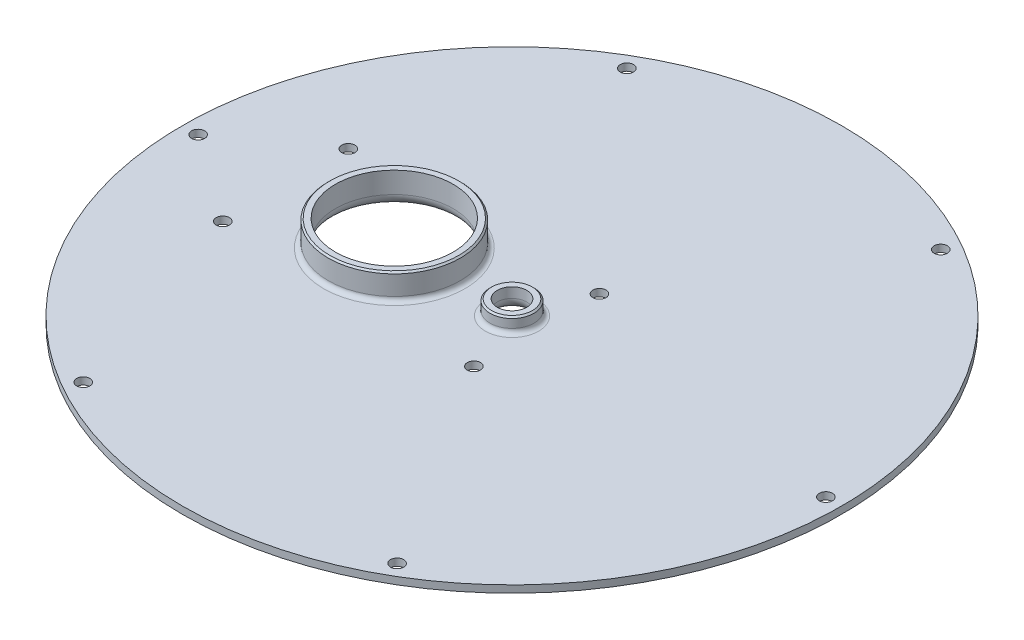
ISO-10303-21;
HEADER;
FILE_DESCRIPTION(('STEP AP214'),'2;1');
FILE_NAME('part.step','',(''),(''),'','','');
FILE_SCHEMA(('AUTOMOTIVE_DESIGN { 1 0 10303 214 1 1 1 1 }'));
ENDSEC;
DATA;
#1=APPLICATION_CONTEXT('core data for automotive mechanical design processes');
#2=APPLICATION_PROTOCOL_DEFINITION('international standard','automotive_design',2000,#1);
#3=PRODUCT_CONTEXT('',#1,'mechanical');
#4=PRODUCT('Part','Part','',(#3));
#5=PRODUCT_RELATED_PRODUCT_CATEGORY('part','',(#4));
#6=PRODUCT_DEFINITION_FORMATION('','',#4);
#7=PRODUCT_DEFINITION_CONTEXT('part definition',#1,'design');
#8=PRODUCT_DEFINITION('design','',#6,#7);
#9=PRODUCT_DEFINITION_SHAPE('','',#8);
#10=(LENGTH_UNIT() NAMED_UNIT(*) SI_UNIT(.MILLI.,.METRE.));
#11=(NAMED_UNIT(*) PLANE_ANGLE_UNIT() SI_UNIT($,.RADIAN.));
#12=(NAMED_UNIT(*) SI_UNIT($,.STERADIAN.) SOLID_ANGLE_UNIT());
#13=UNCERTAINTY_MEASURE_WITH_UNIT(LENGTH_MEASURE(1.E-05),#10,'distance_accuracy_value','');
#14=(GEOMETRIC_REPRESENTATION_CONTEXT(3) GLOBAL_UNCERTAINTY_ASSIGNED_CONTEXT((#13)) GLOBAL_UNIT_ASSIGNED_CONTEXT((#10,
#11,#12)) REPRESENTATION_CONTEXT('',''));
#15=CARTESIAN_POINT('',(0.,0.,0.));
#16=DIRECTION('',(0.,0.,1.));
#17=DIRECTION('',(1.,0.,0.));
#18=AXIS2_PLACEMENT_3D('',#15,#16,#17);
#19=CARTESIAN_POINT('',(0.,-1.15,0.));
#20=DIRECTION('',(0.,1.,0.));
#21=DIRECTION('',(0.,0.,1.));
#22=AXIS2_PLACEMENT_3D('',#19,#20,#21);
#23=CYLINDRICAL_SURFACE('',#22,52.5);
#24=CARTESIAN_POINT('',(0.,-1.15,0.));
#25=DIRECTION('',(0.,1.,0.));
#26=DIRECTION('',(0.,0.,1.));
#27=AXIS2_PLACEMENT_3D('',#24,#25,#26);
#28=CIRCLE('',#27,52.5);
#29=CARTESIAN_POINT('',(0.,-1.15,52.5));
#30=VERTEX_POINT('',#29);
#31=EDGE_CURVE('E358',#30,#30,#28,.T.);
#32=ORIENTED_EDGE('',*,*,#31,.T.);
#33=EDGE_LOOP('',(#32));
#34=FACE_BOUND('',#33,.T.);
#35=CARTESIAN_POINT('',(0.,0.,0.));
#36=DIRECTION('',(0.,1.,0.));
#37=DIRECTION('',(0.,0.,1.));
#38=AXIS2_PLACEMENT_3D('',#35,#36,#37);
#39=CIRCLE('',#38,52.5);
#40=CARTESIAN_POINT('',(0.,0.,52.5));
#41=VERTEX_POINT('',#40);
#42=EDGE_CURVE('E357',#41,#41,#39,.T.);
#43=ORIENTED_EDGE('',*,*,#42,.F.);
#44=EDGE_LOOP('',(#43));
#45=FACE_BOUND('',#44,.T.);
#46=ADVANCED_FACE('F149',(#34,#45),#23,.T.);
#47=CARTESIAN_POINT('',(0.,-1.15,0.));
#48=DIRECTION('',(0.,1.,0.));
#49=DIRECTION('',(0.,0.,1.));
#50=AXIS2_PLACEMENT_3D('',#47,#48,#49);
#51=PLANE('',#50);
#52=CARTESIAN_POINT('',(0.,-1.15,0.));
#53=DIRECTION('',(0.,1.,0.));
#54=DIRECTION('',(0.,0.,1.));
#55=AXIS2_PLACEMENT_3D('',#52,#53,#54);
#56=CIRCLE('',#55,4.2366);
#57=CARTESIAN_POINT('',(0.,-1.15,4.2366));
#58=VERTEX_POINT('',#57);
#59=EDGE_CURVE('E216',#58,#58,#56,.T.);
#60=ORIENTED_EDGE('',*,*,#59,.T.);
#61=EDGE_LOOP('',(#60));
#62=FACE_BOUND('',#61,.T.);
#63=CARTESIAN_POINT('',(-18.75,-1.15,0.));
#64=DIRECTION('',(0.,1.,0.));
#65=DIRECTION('',(0.,0.,1.));
#66=AXIS2_PLACEMENT_3D('',#63,#64,#65);
#67=CIRCLE('',#66,11.2616);
#68=CARTESIAN_POINT('',(-18.75,-1.15,11.2616));
#69=VERTEX_POINT('',#68);
#70=EDGE_CURVE('E249',#69,#69,#67,.T.);
#71=ORIENTED_EDGE('',*,*,#70,.T.);
#72=EDGE_LOOP('',(#71));
#73=FACE_BOUND('',#72,.T.);
#74=CARTESIAN_POINT('',(-50.,-1.15,0.));
#75=DIRECTION('',(0.,1.,0.));
#76=DIRECTION('',(0.,0.,1.));
#77=AXIS2_PLACEMENT_3D('',#74,#75,#76);
#78=CIRCLE('',#77,1.05);
#79=CARTESIAN_POINT('',(-50.,-1.15,1.05));
#80=VERTEX_POINT('',#79);
#81=EDGE_CURVE('E281',#80,#80,#78,.T.);
#82=ORIENTED_EDGE('',*,*,#81,.T.);
#83=EDGE_LOOP('',(#82));
#84=FACE_BOUND('',#83,.T.);
#85=CARTESIAN_POINT('',(-25.0000000000005,-1.15,43.3012701892216));
#86=DIRECTION('',(0.,1.,0.));
#87=DIRECTION('',(0.,0.,1.));
#88=AXIS2_PLACEMENT_3D('',#85,#86,#87);
#89=CIRCLE('',#88,1.05);
#90=CARTESIAN_POINT('',(-25.0000000000005,-1.15,44.3512701892216));
#91=VERTEX_POINT('',#90);
#92=EDGE_CURVE('E289',#91,#91,#89,.T.);
#93=ORIENTED_EDGE('',*,*,#92,.T.);
#94=EDGE_LOOP('',(#93));
#95=FACE_BOUND('',#94,.T.);
#96=CARTESIAN_POINT('',(24.9999999999996,-1.15,43.3012701892222));
#97=DIRECTION('',(0.,1.,0.));
#98=DIRECTION('',(0.,0.,1.));
#99=AXIS2_PLACEMENT_3D('',#96,#97,#98);
#100=CIRCLE('',#99,1.05);
#101=CARTESIAN_POINT('',(24.9999999999996,-1.15,44.3512701892222));
#102=VERTEX_POINT('',#101);
#103=EDGE_CURVE('E297',#102,#102,#100,.T.);
#104=ORIENTED_EDGE('',*,*,#103,.T.);
#105=EDGE_LOOP('',(#104));
#106=FACE_BOUND('',#105,.T.);
#107=CARTESIAN_POINT('',(50.,-1.15,3.49148133884313E-13));
#108=DIRECTION('',(0.,1.,0.));
#109=DIRECTION('',(0.,0.,1.));
#110=AXIS2_PLACEMENT_3D('',#107,#108,#109);
#111=CIRCLE('',#110,1.05);
#112=CARTESIAN_POINT('',(50.,-1.15,1.05000000000035));
#113=VERTEX_POINT('',#112);
#114=EDGE_CURVE('E305',#113,#113,#111,.T.);
#115=ORIENTED_EDGE('',*,*,#114,.T.);
#116=EDGE_LOOP('',(#115));
#117=FACE_BOUND('',#116,.T.);
#118=CARTESIAN_POINT('',(25.0000000000002,-1.15,-43.3012701892218));
#119=DIRECTION('',(0.,1.,0.));
#120=DIRECTION('',(0.,0.,1.));
#121=AXIS2_PLACEMENT_3D('',#118,#119,#120);
#122=CIRCLE('',#121,1.05);
#123=CARTESIAN_POINT('',(25.0000000000002,-1.15,-42.2512701892218));
#124=VERTEX_POINT('',#123);
#125=EDGE_CURVE('E313',#124,#124,#122,.T.);
#126=ORIENTED_EDGE('',*,*,#125,.T.);
#127=EDGE_LOOP('',(#126));
#128=FACE_BOUND('',#127,.T.);
#129=CARTESIAN_POINT('',(-24.9999999999999,-1.15,-43.301270189222));
#130=DIRECTION('',(0.,1.,0.));
#131=DIRECTION('',(0.,0.,1.));
#132=AXIS2_PLACEMENT_3D('',#129,#130,#131);
#133=CIRCLE('',#132,1.05);
#134=CARTESIAN_POINT('',(-24.9999999999999,-1.15,-42.251270189222));
#135=VERTEX_POINT('',#134);
#136=EDGE_CURVE('E321',#135,#135,#133,.T.);
#137=ORIENTED_EDGE('',*,*,#136,.T.);
#138=EDGE_LOOP('',(#137));
#139=FACE_BOUND('',#138,.T.);
#140=CARTESIAN_POINT('',(3.92949192431122,-1.15,-10.));
#141=DIRECTION('',(0.,1.,0.));
#142=DIRECTION('',(0.,0.,1.));
#143=AXIS2_PLACEMENT_3D('',#140,#141,#142);
#144=CIRCLE('',#143,1.05);
#145=CARTESIAN_POINT('',(3.92949192431122,-1.15,-8.95));
#146=VERTEX_POINT('',#145);
#147=EDGE_CURVE('E329',#146,#146,#144,.T.);
#148=ORIENTED_EDGE('',*,*,#147,.T.);
#149=EDGE_LOOP('',(#148));
#150=FACE_BOUND('',#149,.T.);
#151=CARTESIAN_POINT('',(3.92949192431122,-1.15,10.));
#152=DIRECTION('',(0.,1.,0.));
#153=DIRECTION('',(0.,0.,1.));
#154=AXIS2_PLACEMENT_3D('',#151,#152,#153);
#155=CIRCLE('',#154,1.05);
#156=CARTESIAN_POINT('',(3.92949192431122,-1.15,11.05));
#157=VERTEX_POINT('',#156);
#158=EDGE_CURVE('E337',#157,#157,#155,.T.);
#159=ORIENTED_EDGE('',*,*,#158,.T.);
#160=EDGE_LOOP('',(#159));
#161=FACE_BOUND('',#160,.T.);
#162=CARTESIAN_POINT('',(-36.0705080756888,-1.15,10.));
#163=DIRECTION('',(0.,1.,0.));
#164=DIRECTION('',(0.,0.,1.));
#165=AXIS2_PLACEMENT_3D('',#162,#163,#164);
#166=CIRCLE('',#165,1.05);
#167=CARTESIAN_POINT('',(-36.0705080756888,-1.15,11.05));
#168=VERTEX_POINT('',#167);
#169=EDGE_CURVE('E345',#168,#168,#166,.T.);
#170=ORIENTED_EDGE('',*,*,#169,.T.);
#171=EDGE_LOOP('',(#170));
#172=FACE_BOUND('',#171,.T.);
#173=CARTESIAN_POINT('',(-36.0705080756888,-1.15,-10.));
#174=DIRECTION('',(0.,1.,0.));
#175=DIRECTION('',(0.,0.,1.));
#176=AXIS2_PLACEMENT_3D('',#173,#174,#175);
#177=CIRCLE('',#176,1.05);
#178=CARTESIAN_POINT('',(-36.0705080756888,-1.15,-8.95));
#179=VERTEX_POINT('',#178);
#180=EDGE_CURVE('E353',#179,#179,#177,.T.);
#181=ORIENTED_EDGE('',*,*,#180,.T.);
#182=EDGE_LOOP('',(#181));
#183=FACE_BOUND('',#182,.T.);
#184=ORIENTED_EDGE('',*,*,#31,.F.);
#185=EDGE_LOOP('',(#184));
#186=FACE_BOUND('',#185,.T.);
#187=ADVANCED_FACE('F401',(#62,#73,#84,#95,#106,#117,#128,#139,#150,#161,#172,#183,#186),#51,.F.);
#188=CARTESIAN_POINT('',(0.,0.,0.));
#189=DIRECTION('',(0.,1.,0.));
#190=DIRECTION('',(0.,0.,1.));
#191=AXIS2_PLACEMENT_3D('',#188,#189,#190);
#192=PLANE('',#191);
#193=CARTESIAN_POINT('',(0.,0.,0.));
#194=DIRECTION('',(0.,1.,0.));
#195=DIRECTION('',(0.,0.,1.));
#196=AXIS2_PLACEMENT_3D('',#193,#194,#195);
#197=CIRCLE('',#196,4.2366);
#198=CARTESIAN_POINT('',(0.,0.,4.2366));
#199=VERTEX_POINT('',#198);
#200=EDGE_CURVE('E369',#199,#199,#197,.T.);
#201=ORIENTED_EDGE('',*,*,#200,.F.);
#202=EDGE_LOOP('',(#201));
#203=FACE_BOUND('',#202,.T.);
#204=CARTESIAN_POINT('',(-18.75,0.,0.));
#205=DIRECTION('',(0.,1.,0.));
#206=DIRECTION('',(0.,0.,1.));
#207=AXIS2_PLACEMENT_3D('',#204,#205,#206);
#208=CIRCLE('',#207,11.2616);
#209=CARTESIAN_POINT('',(-18.75,0.,11.2616));
#210=VERTEX_POINT('',#209);
#211=EDGE_CURVE('E362',#210,#210,#208,.T.);
#212=ORIENTED_EDGE('',*,*,#211,.F.);
#213=EDGE_LOOP('',(#212));
#214=FACE_BOUND('',#213,.T.);
#215=CARTESIAN_POINT('',(-50.,0.,0.));
#216=DIRECTION('',(0.,1.,0.));
#217=DIRECTION('',(0.,0.,1.));
#218=AXIS2_PLACEMENT_3D('',#215,#216,#217);
#219=CIRCLE('',#218,1.04999999999999);
#220=CARTESIAN_POINT('',(-50.,0.,1.04999999999999));
#221=VERTEX_POINT('',#220);
#222=EDGE_CURVE('E277',#221,#221,#219,.T.);
#223=ORIENTED_EDGE('',*,*,#222,.F.);
#224=EDGE_LOOP('',(#223));
#225=FACE_BOUND('',#224,.T.);
#226=CARTESIAN_POINT('',(-25.0000000000005,0.,43.3012701892216));
#227=DIRECTION('',(0.,1.,0.));
#228=DIRECTION('',(0.,0.,1.));
#229=AXIS2_PLACEMENT_3D('',#226,#227,#228);
#230=CIRCLE('',#229,1.04999999999999);
#231=CARTESIAN_POINT('',(-25.0000000000005,0.,44.3512701892216));
#232=VERTEX_POINT('',#231);
#233=EDGE_CURVE('E285',#232,#232,#230,.T.);
#234=ORIENTED_EDGE('',*,*,#233,.F.);
#235=EDGE_LOOP('',(#234));
#236=FACE_BOUND('',#235,.T.);
#237=CARTESIAN_POINT('',(24.9999999999996,0.,43.3012701892222));
#238=DIRECTION('',(0.,1.,0.));
#239=DIRECTION('',(0.,0.,1.));
#240=AXIS2_PLACEMENT_3D('',#237,#238,#239);
#241=CIRCLE('',#240,1.04999999999999);
#242=CARTESIAN_POINT('',(24.9999999999996,0.,44.3512701892222));
#243=VERTEX_POINT('',#242);
#244=EDGE_CURVE('E293',#243,#243,#241,.T.);
#245=ORIENTED_EDGE('',*,*,#244,.F.);
#246=EDGE_LOOP('',(#245));
#247=FACE_BOUND('',#246,.T.);
#248=CARTESIAN_POINT('',(50.,0.,3.49148133884313E-13));
#249=DIRECTION('',(0.,1.,0.));
#250=DIRECTION('',(0.,0.,1.));
#251=AXIS2_PLACEMENT_3D('',#248,#249,#250);
#252=CIRCLE('',#251,1.04999999999999);
#253=CARTESIAN_POINT('',(50.,0.,1.05000000000034));
#254=VERTEX_POINT('',#253);
#255=EDGE_CURVE('E301',#254,#254,#252,.T.);
#256=ORIENTED_EDGE('',*,*,#255,.F.);
#257=EDGE_LOOP('',(#256));
#258=FACE_BOUND('',#257,.T.);
#259=CARTESIAN_POINT('',(25.0000000000002,0.,-43.3012701892218));
#260=DIRECTION('',(0.,1.,0.));
#261=DIRECTION('',(0.,0.,1.));
#262=AXIS2_PLACEMENT_3D('',#259,#260,#261);
#263=CIRCLE('',#262,1.04999999999999);
#264=CARTESIAN_POINT('',(25.0000000000002,0.,-42.2512701892218));
#265=VERTEX_POINT('',#264);
#266=EDGE_CURVE('E309',#265,#265,#263,.T.);
#267=ORIENTED_EDGE('',*,*,#266,.F.);
#268=EDGE_LOOP('',(#267));
#269=FACE_BOUND('',#268,.T.);
#270=CARTESIAN_POINT('',(-24.9999999999999,0.,-43.301270189222));
#271=DIRECTION('',(0.,1.,0.));
#272=DIRECTION('',(0.,0.,1.));
#273=AXIS2_PLACEMENT_3D('',#270,#271,#272);
#274=CIRCLE('',#273,1.04999999999999);
#275=CARTESIAN_POINT('',(-24.9999999999999,0.,-42.251270189222));
#276=VERTEX_POINT('',#275);
#277=EDGE_CURVE('E317',#276,#276,#274,.T.);
#278=ORIENTED_EDGE('',*,*,#277,.F.);
#279=EDGE_LOOP('',(#278));
#280=FACE_BOUND('',#279,.T.);
#281=CARTESIAN_POINT('',(3.92949192431122,0.,-10.));
#282=DIRECTION('',(0.,1.,0.));
#283=DIRECTION('',(0.,0.,1.));
#284=AXIS2_PLACEMENT_3D('',#281,#282,#283);
#285=CIRCLE('',#284,1.04999999999999);
#286=CARTESIAN_POINT('',(3.92949192431122,0.,-8.95000000000001));
#287=VERTEX_POINT('',#286);
#288=EDGE_CURVE('E325',#287,#287,#285,.T.);
#289=ORIENTED_EDGE('',*,*,#288,.F.);
#290=EDGE_LOOP('',(#289));
#291=FACE_BOUND('',#290,.T.);
#292=CARTESIAN_POINT('',(3.92949192431122,0.,10.));
#293=DIRECTION('',(0.,1.,0.));
#294=DIRECTION('',(0.,0.,1.));
#295=AXIS2_PLACEMENT_3D('',#292,#293,#294);
#296=CIRCLE('',#295,1.04999999999999);
#297=CARTESIAN_POINT('',(3.92949192431122,0.,11.05));
#298=VERTEX_POINT('',#297);
#299=EDGE_CURVE('E333',#298,#298,#296,.T.);
#300=ORIENTED_EDGE('',*,*,#299,.F.);
#301=EDGE_LOOP('',(#300));
#302=FACE_BOUND('',#301,.T.);
#303=CARTESIAN_POINT('',(-36.0705080756888,0.,10.));
#304=DIRECTION('',(0.,1.,0.));
#305=DIRECTION('',(0.,0.,1.));
#306=AXIS2_PLACEMENT_3D('',#303,#304,#305);
#307=CIRCLE('',#306,1.04999999999999);
#308=CARTESIAN_POINT('',(-36.0705080756888,0.,11.05));
#309=VERTEX_POINT('',#308);
#310=EDGE_CURVE('E341',#309,#309,#307,.T.);
#311=ORIENTED_EDGE('',*,*,#310,.F.);
#312=EDGE_LOOP('',(#311));
#313=FACE_BOUND('',#312,.T.);
#314=CARTESIAN_POINT('',(-36.0705080756888,0.,-10.));
#315=DIRECTION('',(0.,1.,0.));
#316=DIRECTION('',(0.,0.,1.));
#317=AXIS2_PLACEMENT_3D('',#314,#315,#316);
#318=CIRCLE('',#317,1.04999999999999);
#319=CARTESIAN_POINT('',(-36.0705080756888,0.,-8.95000000000001));
#320=VERTEX_POINT('',#319);
#321=EDGE_CURVE('E349',#320,#320,#318,.T.);
#322=ORIENTED_EDGE('',*,*,#321,.F.);
#323=EDGE_LOOP('',(#322));
#324=FACE_BOUND('',#323,.T.);
#325=ORIENTED_EDGE('',*,*,#42,.T.);
#326=EDGE_LOOP('',(#325));
#327=FACE_BOUND('',#326,.T.);
#328=ADVANCED_FACE('F397',(#203,#214,#225,#236,#247,#258,#269,#280,#291,#302,#313,#324,#327),
#192,.T.);
#329=CARTESIAN_POINT('',(-36.0705080756888,0.,-10.));
#330=DIRECTION('',(0.,1.,0.));
#331=DIRECTION('',(0.,0.,1.));
#332=AXIS2_PLACEMENT_3D('',#329,#330,#331);
#333=CYLINDRICAL_SURFACE('',#332,1.05);
#334=ORIENTED_EDGE('',*,*,#180,.F.);
#335=EDGE_LOOP('',(#334));
#336=FACE_BOUND('',#335,.T.);
#337=ORIENTED_EDGE('',*,*,#321,.T.);
#338=EDGE_LOOP('',(#337));
#339=FACE_BOUND('',#338,.T.);
#340=ADVANCED_FACE('F400',(#336,#339),#333,.F.);
#341=CARTESIAN_POINT('',(-36.0705080756888,0.,10.));
#342=DIRECTION('',(0.,1.,0.));
#343=DIRECTION('',(0.,0.,1.));
#344=AXIS2_PLACEMENT_3D('',#341,#342,#343);
#345=CYLINDRICAL_SURFACE('',#344,1.05);
#346=ORIENTED_EDGE('',*,*,#169,.F.);
#347=EDGE_LOOP('',(#346));
#348=FACE_BOUND('',#347,.T.);
#349=ORIENTED_EDGE('',*,*,#310,.T.);
#350=EDGE_LOOP('',(#349));
#351=FACE_BOUND('',#350,.T.);
#352=ADVANCED_FACE('F507',(#348,#351),#345,.F.);
#353=CARTESIAN_POINT('',(3.92949192431122,0.,10.));
#354=DIRECTION('',(0.,1.,0.));
#355=DIRECTION('',(0.,0.,1.));
#356=AXIS2_PLACEMENT_3D('',#353,#354,#355);
#357=CYLINDRICAL_SURFACE('',#356,1.04999999999999);
#358=ORIENTED_EDGE('',*,*,#158,.F.);
#359=EDGE_LOOP('',(#358));
#360=FACE_BOUND('',#359,.T.);
#361=ORIENTED_EDGE('',*,*,#299,.T.);
#362=EDGE_LOOP('',(#361));
#363=FACE_BOUND('',#362,.T.);
#364=ADVANCED_FACE('F503',(#360,#363),#357,.F.);
#365=CARTESIAN_POINT('',(3.92949192431122,0.,-10.));
#366=DIRECTION('',(0.,1.,0.));
#367=DIRECTION('',(0.,0.,1.));
#368=AXIS2_PLACEMENT_3D('',#365,#366,#367);
#369=CYLINDRICAL_SURFACE('',#368,1.04999999999999);
#370=ORIENTED_EDGE('',*,*,#147,.F.);
#371=EDGE_LOOP('',(#370));
#372=FACE_BOUND('',#371,.T.);
#373=ORIENTED_EDGE('',*,*,#288,.T.);
#374=EDGE_LOOP('',(#373));
#375=FACE_BOUND('',#374,.T.);
#376=ADVANCED_FACE('F499',(#372,#375),#369,.F.);
#377=CARTESIAN_POINT('',(-24.9999999999999,0.,-43.301270189222));
#378=DIRECTION('',(0.,1.,0.));
#379=DIRECTION('',(0.,0.,1.));
#380=AXIS2_PLACEMENT_3D('',#377,#378,#379);
#381=CYLINDRICAL_SURFACE('',#380,1.04999999999999);
#382=ORIENTED_EDGE('',*,*,#136,.F.);
#383=EDGE_LOOP('',(#382));
#384=FACE_BOUND('',#383,.T.);
#385=ORIENTED_EDGE('',*,*,#277,.T.);
#386=EDGE_LOOP('',(#385));
#387=FACE_BOUND('',#386,.T.);
#388=ADVANCED_FACE('F495',(#384,#387),#381,.F.);
#389=CARTESIAN_POINT('',(25.0000000000002,0.,-43.3012701892218));
#390=DIRECTION('',(0.,1.,0.));
#391=DIRECTION('',(0.,0.,1.));
#392=AXIS2_PLACEMENT_3D('',#389,#390,#391);
#393=CYLINDRICAL_SURFACE('',#392,1.04999999999999);
#394=ORIENTED_EDGE('',*,*,#125,.F.);
#395=EDGE_LOOP('',(#394));
#396=FACE_BOUND('',#395,.T.);
#397=ORIENTED_EDGE('',*,*,#266,.T.);
#398=EDGE_LOOP('',(#397));
#399=FACE_BOUND('',#398,.T.);
#400=ADVANCED_FACE('F491',(#396,#399),#393,.F.);
#401=CARTESIAN_POINT('',(50.,0.,3.49148133884313E-13));
#402=DIRECTION('',(0.,1.,0.));
#403=DIRECTION('',(0.,0.,1.));
#404=AXIS2_PLACEMENT_3D('',#401,#402,#403);
#405=CYLINDRICAL_SURFACE('',#404,1.05);
#406=ORIENTED_EDGE('',*,*,#114,.F.);
#407=EDGE_LOOP('',(#406));
#408=FACE_BOUND('',#407,.T.);
#409=ORIENTED_EDGE('',*,*,#255,.T.);
#410=EDGE_LOOP('',(#409));
#411=FACE_BOUND('',#410,.T.);
#412=ADVANCED_FACE('F487',(#408,#411),#405,.F.);
#413=CARTESIAN_POINT('',(24.9999999999996,0.,43.3012701892222));
#414=DIRECTION('',(0.,1.,0.));
#415=DIRECTION('',(0.,0.,1.));
#416=AXIS2_PLACEMENT_3D('',#413,#414,#415);
#417=CYLINDRICAL_SURFACE('',#416,1.04999999999999);
#418=ORIENTED_EDGE('',*,*,#103,.F.);
#419=EDGE_LOOP('',(#418));
#420=FACE_BOUND('',#419,.T.);
#421=ORIENTED_EDGE('',*,*,#244,.T.);
#422=EDGE_LOOP('',(#421));
#423=FACE_BOUND('',#422,.T.);
#424=ADVANCED_FACE('F483',(#420,#423),#417,.F.);
#425=CARTESIAN_POINT('',(-25.0000000000005,0.,43.3012701892216));
#426=DIRECTION('',(0.,1.,0.));
#427=DIRECTION('',(0.,0.,1.));
#428=AXIS2_PLACEMENT_3D('',#425,#426,#427);
#429=CYLINDRICAL_SURFACE('',#428,1.04999999999999);
#430=ORIENTED_EDGE('',*,*,#92,.F.);
#431=EDGE_LOOP('',(#430));
#432=FACE_BOUND('',#431,.T.);
#433=ORIENTED_EDGE('',*,*,#233,.T.);
#434=EDGE_LOOP('',(#433));
#435=FACE_BOUND('',#434,.T.);
#436=ADVANCED_FACE('F479',(#432,#435),#429,.F.);
#437=CARTESIAN_POINT('',(-50.,0.,0.));
#438=DIRECTION('',(0.,1.,0.));
#439=DIRECTION('',(0.,0.,1.));
#440=AXIS2_PLACEMENT_3D('',#437,#438,#439);
#441=CYLINDRICAL_SURFACE('',#440,1.05);
#442=ORIENTED_EDGE('',*,*,#81,.F.);
#443=EDGE_LOOP('',(#442));
#444=FACE_BOUND('',#443,.T.);
#445=ORIENTED_EDGE('',*,*,#222,.T.);
#446=EDGE_LOOP('',(#445));
#447=FACE_BOUND('',#446,.T.);
#448=ADVANCED_FACE('F475',(#444,#447),#441,.F.);
#449=CARTESIAN_POINT('',(-18.75,4.1,0.));
#450=DIRECTION('',(0.,-1.,0.));
#451=DIRECTION('',(0.,0.,-1.));
#452=AXIS2_PLACEMENT_3D('',#449,#450,#451);
#453=PLANE('',#452);
#454=CARTESIAN_POINT('',(-18.75,4.1,0.));
#455=DIRECTION('',(0.,1.,0.));
#456=DIRECTION('',(0.,0.,1.));
#457=AXIS2_PLACEMENT_3D('',#454,#455,#456);
#458=CIRCLE('',#457,9.37500000000001);
#459=CARTESIAN_POINT('',(-18.75,4.1,9.37500000000001));
#460=VERTEX_POINT('',#459);
#461=EDGE_CURVE('E254',#460,#460,#458,.T.);
#462=ORIENTED_EDGE('',*,*,#461,.F.);
#463=EDGE_LOOP('',(#462));
#464=FACE_BOUND('',#463,.T.);
#465=CARTESIAN_POINT('',(-18.75,4.1,0.));
#466=DIRECTION('',(0.,-1.,0.));
#467=DIRECTION('',(0.,0.,-1.));
#468=AXIS2_PLACEMENT_3D('',#465,#466,#467);
#469=CIRCLE('',#468,10.275);
#470=CARTESIAN_POINT('',(-18.75,4.1,10.275));
#471=VERTEX_POINT('',#470);
#472=EDGE_CURVE('E160',#471,#471,#469,.F.);
#473=ORIENTED_EDGE('',*,*,#472,.T.);
#474=EDGE_LOOP('',(#473));
#475=FACE_BOUND('',#474,.T.);
#476=ADVANCED_FACE('F461',(#464,#475),#453,.F.);
#477=CARTESIAN_POINT('',(-18.75,0.,0.));
#478=DIRECTION('',(0.,1.,0.));
#479=DIRECTION('',(0.,0.,1.));
#480=AXIS2_PLACEMENT_3D('',#477,#478,#479);
#481=CYLINDRICAL_SURFACE('',#480,9.37500000000001);
#482=DIRECTION('',(0.,1.,0.));
#483=VECTOR('',#482,1.);
#484=CARTESIAN_POINT('',(-18.75,0.,9.37500000000001));
#485=LINE('',#484,#483);
#486=CARTESIAN_POINT('',(-18.75,0.7366,9.37500000000001));
#487=VERTEX_POINT('',#486);
#488=EDGE_CURVE('E245',#487,#460,#485,.T.);
#489=ORIENTED_EDGE('',*,*,#488,.F.);
#490=CARTESIAN_POINT('',(-18.75,0.7366,0.));
#491=DIRECTION('',(0.,1.,0.));
#492=DIRECTION('',(0.,0.,1.));
#493=AXIS2_PLACEMENT_3D('',#490,#491,#492);
#494=CIRCLE('',#493,9.37500000000001);
#495=EDGE_CURVE('E251',#487,#487,#494,.T.);
#496=ORIENTED_EDGE('',*,*,#495,.F.);
#497=ORIENTED_EDGE('',*,*,#488,.T.);
#498=ORIENTED_EDGE('',*,*,#461,.T.);
#499=EDGE_LOOP('',(#489,#496,#497,#498));
#500=FACE_BOUND('',#499,.T.);
#501=ADVANCED_FACE('F457',(#500),#481,.F.);
#502=CARTESIAN_POINT('',(-18.75,0.7366,0.));
#503=DIRECTION('',(0.,1.,0.));
#504=DIRECTION('',(0.,0.,1.));
#505=AXIS2_PLACEMENT_3D('',#502,#503,#504);
#506=TOROIDAL_SURFACE('',#505,11.2616,1.8866);
#507=CARTESIAN_POINT('',(-18.75,0.7366,11.2616));
#508=DIRECTION('',(-1.,0.,0.));
#509=DIRECTION('',(0.,0.,1.));
#510=AXIS2_PLACEMENT_3D('',#507,#508,#509);
#511=CIRCLE('',#510,1.8866);
#512=EDGE_CURVE('E250',#69,#487,#511,.F.);
#513=ORIENTED_EDGE('',*,*,#512,.F.);
#514=ORIENTED_EDGE('',*,*,#70,.F.);
#515=ORIENTED_EDGE('',*,*,#512,.T.);
#516=ORIENTED_EDGE('',*,*,#495,.T.);
#517=EDGE_LOOP('',(#513,#514,#515,#516));
#518=FACE_BOUND('',#517,.T.);
#519=ADVANCED_FACE('F460',(#518),#506,.T.);
#520=CARTESIAN_POINT('',(-18.75,0.,0.));
#521=DIRECTION('',(0.,1.,0.));
#522=DIRECTION('',(0.,0.,1.));
#523=AXIS2_PLACEMENT_3D('',#520,#521,#522);
#524=CYLINDRICAL_SURFACE('',#523,10.525);
#525=DIRECTION('',(0.,1.,0.));
#526=VECTOR('',#525,1.);
#527=CARTESIAN_POINT('',(-18.75,0.,10.525));
#528=LINE('',#527,#526);
#529=CARTESIAN_POINT('',(-18.75,0.7366,10.525));
#530=VERTEX_POINT('',#529);
#531=CARTESIAN_POINT('',(-18.75,3.85000000000001,10.525));
#532=VERTEX_POINT('',#531);
#533=EDGE_CURVE('E268',#530,#532,#528,.T.);
#534=ORIENTED_EDGE('',*,*,#533,.T.);
#535=CARTESIAN_POINT('',(-18.75,3.85000000000001,0.));
#536=DIRECTION('',(0.,1.,0.));
#537=DIRECTION('',(0.,0.,1.));
#538=AXIS2_PLACEMENT_3D('',#535,#536,#537);
#539=CIRCLE('',#538,10.525);
#540=EDGE_CURVE('E12',#532,#532,#539,.F.);
#541=ORIENTED_EDGE('',*,*,#540,.T.);
#542=ORIENTED_EDGE('',*,*,#533,.F.);
#543=CARTESIAN_POINT('',(-18.75,0.7366,0.));
#544=DIRECTION('',(0.,1.,0.));
#545=DIRECTION('',(0.,0.,1.));
#546=AXIS2_PLACEMENT_3D('',#543,#544,#545);
#547=CIRCLE('',#546,10.525);
#548=EDGE_CURVE('E258',#530,#530,#547,.T.);
#549=ORIENTED_EDGE('',*,*,#548,.T.);
#550=EDGE_LOOP('',(#534,#541,#542,#549));
#551=FACE_BOUND('',#550,.T.);
#552=ADVANCED_FACE('F465',(#551),#524,.T.);
#553=CARTESIAN_POINT('',(-18.75,0.7366,0.));
#554=DIRECTION('',(0.,1.,0.));
#555=DIRECTION('',(0.,0.,1.));
#556=AXIS2_PLACEMENT_3D('',#553,#554,#555);
#557=TOROIDAL_SURFACE('',#556,11.2616,0.7366);
#558=CARTESIAN_POINT('',(-18.75,0.7366,11.2616));
#559=DIRECTION('',(-1.,0.,0.));
#560=DIRECTION('',(0.,0.,1.));
#561=AXIS2_PLACEMENT_3D('',#558,#559,#560);
#562=CIRCLE('',#561,0.7366);
#563=EDGE_CURVE('E244',#210,#530,#562,.F.);
#564=ORIENTED_EDGE('',*,*,#563,.T.);
#565=ORIENTED_EDGE('',*,*,#548,.F.);
#566=ORIENTED_EDGE('',*,*,#563,.F.);
#567=ORIENTED_EDGE('',*,*,#211,.T.);
#568=EDGE_LOOP('',(#564,#565,#566,#567));
#569=FACE_BOUND('',#568,.T.);
#570=ADVANCED_FACE('F455',(#569),#557,.F.);
#571=CARTESIAN_POINT('',(0.,2.35,0.));
#572=DIRECTION('',(0.,-1.,0.));
#573=DIRECTION('',(0.,0.,-1.));
#574=AXIS2_PLACEMENT_3D('',#571,#572,#573);
#575=PLANE('',#574);
#576=CARTESIAN_POINT('',(0.,2.35,0.));
#577=DIRECTION('',(0.,1.,0.));
#578=DIRECTION('',(0.,0.,1.));
#579=AXIS2_PLACEMENT_3D('',#576,#577,#578);
#580=CIRCLE('',#579,2.35);
#581=CARTESIAN_POINT('',(0.,2.35,2.35));
#582=VERTEX_POINT('',#581);
#583=EDGE_CURVE('E215',#582,#582,#580,.T.);
#584=ORIENTED_EDGE('',*,*,#583,.F.);
#585=EDGE_LOOP('',(#584));
#586=FACE_BOUND('',#585,.T.);
#587=CARTESIAN_POINT('',(0.,2.35,0.));
#588=DIRECTION('',(0.,-1.,0.));
#589=DIRECTION('',(0.,0.,-1.));
#590=AXIS2_PLACEMENT_3D('',#587,#588,#589);
#591=CIRCLE('',#590,3.25000000000002);
#592=CARTESIAN_POINT('',(0.,2.35,3.25000000000002));
#593=VERTEX_POINT('',#592);
#594=EDGE_CURVE('E373',#593,#593,#591,.F.);
#595=ORIENTED_EDGE('',*,*,#594,.T.);
#596=EDGE_LOOP('',(#595));
#597=FACE_BOUND('',#596,.T.);
#598=ADVANCED_FACE('F451',(#586,#597),#575,.F.);
#599=CARTESIAN_POINT('',(0.,0.,0.));
#600=DIRECTION('',(0.,1.,0.));
#601=DIRECTION('',(0.,0.,1.));
#602=AXIS2_PLACEMENT_3D('',#599,#600,#601);
#603=CYLINDRICAL_SURFACE('',#602,2.35);
#604=DIRECTION('',(0.,1.,0.));
#605=VECTOR('',#604,1.);
#606=CARTESIAN_POINT('',(0.,0.,2.35));
#607=LINE('',#606,#605);
#608=CARTESIAN_POINT('',(0.,0.7366,2.35));
#609=VERTEX_POINT('',#608);
#610=EDGE_CURVE('E224',#609,#582,#607,.T.);
#611=ORIENTED_EDGE('',*,*,#610,.F.);
#612=CARTESIAN_POINT('',(0.,0.7366,0.));
#613=DIRECTION('',(0.,1.,0.));
#614=DIRECTION('',(0.,0.,1.));
#615=AXIS2_PLACEMENT_3D('',#612,#613,#614);
#616=CIRCLE('',#615,2.35);
#617=EDGE_CURVE('E207',#609,#609,#616,.T.);
#618=ORIENTED_EDGE('',*,*,#617,.F.);
#619=ORIENTED_EDGE('',*,*,#610,.T.);
#620=ORIENTED_EDGE('',*,*,#583,.T.);
#621=EDGE_LOOP('',(#611,#618,#619,#620));
#622=FACE_BOUND('',#621,.T.);
#623=ADVANCED_FACE('F454',(#622),#603,.F.);
#624=CARTESIAN_POINT('',(0.,0.7366,0.));
#625=DIRECTION('',(0.,1.,0.));
#626=DIRECTION('',(0.,0.,1.));
#627=AXIS2_PLACEMENT_3D('',#624,#625,#626);
#628=TOROIDAL_SURFACE('',#627,4.2366,1.8866);
#629=CARTESIAN_POINT('',(0.,0.7366,4.2366));
#630=DIRECTION('',(-1.,0.,0.));
#631=DIRECTION('',(0.,0.,1.));
#632=AXIS2_PLACEMENT_3D('',#629,#630,#631);
#633=CIRCLE('',#632,1.8866);
#634=EDGE_CURVE('E210',#58,#609,#633,.F.);
#635=ORIENTED_EDGE('',*,*,#634,.F.);
#636=ORIENTED_EDGE('',*,*,#59,.F.);
#637=ORIENTED_EDGE('',*,*,#634,.T.);
#638=ORIENTED_EDGE('',*,*,#617,.T.);
#639=EDGE_LOOP('',(#635,#636,#637,#638));
#640=FACE_BOUND('',#639,.T.);
#641=ADVANCED_FACE('F208',(#640),#628,.T.);
#642=CARTESIAN_POINT('',(0.,0.,0.));
#643=DIRECTION('',(0.,1.,0.));
#644=DIRECTION('',(0.,0.,1.));
#645=AXIS2_PLACEMENT_3D('',#642,#643,#644);
#646=CYLINDRICAL_SURFACE('',#645,3.5);
#647=DIRECTION('',(0.,1.,0.));
#648=VECTOR('',#647,1.);
#649=CARTESIAN_POINT('',(0.,0.,3.5));
#650=LINE('',#649,#648);
#651=CARTESIAN_POINT('',(0.,0.7366,3.5));
#652=VERTEX_POINT('',#651);
#653=CARTESIAN_POINT('',(0.,2.10000000000001,3.5));
#654=VERTEX_POINT('',#653);
#655=EDGE_CURVE('E234',#652,#654,#650,.T.);
#656=ORIENTED_EDGE('',*,*,#655,.T.);
#657=CARTESIAN_POINT('',(0.,2.10000000000001,0.));
#658=DIRECTION('',(0.,1.,0.));
#659=DIRECTION('',(0.,0.,1.));
#660=AXIS2_PLACEMENT_3D('',#657,#658,#659);
#661=CIRCLE('',#660,3.5);
#662=EDGE_CURVE('E377',#654,#654,#661,.F.);
#663=ORIENTED_EDGE('',*,*,#662,.T.);
#664=ORIENTED_EDGE('',*,*,#655,.F.);
#665=CARTESIAN_POINT('',(0.,0.7366,0.));
#666=DIRECTION('',(0.,1.,0.));
#667=DIRECTION('',(0.,0.,1.));
#668=AXIS2_PLACEMENT_3D('',#665,#666,#667);
#669=CIRCLE('',#668,3.5);
#670=EDGE_CURVE('E229',#652,#652,#669,.T.);
#671=ORIENTED_EDGE('',*,*,#670,.T.);
#672=EDGE_LOOP('',(#656,#663,#664,#671));
#673=FACE_BOUND('',#672,.T.);
#674=ADVANCED_FACE('F391',(#673),#646,.T.);
#675=CARTESIAN_POINT('',(0.,0.7366,0.));
#676=DIRECTION('',(0.,1.,0.));
#677=DIRECTION('',(0.,0.,1.));
#678=AXIS2_PLACEMENT_3D('',#675,#676,#677);
#679=TOROIDAL_SURFACE('',#678,4.2366,0.7366);
#680=CARTESIAN_POINT('',(0.,0.7366,4.2366));
#681=DIRECTION('',(-1.,0.,0.));
#682=DIRECTION('',(0.,0.,1.));
#683=AXIS2_PLACEMENT_3D('',#680,#681,#682);
#684=CIRCLE('',#683,0.7366);
#685=EDGE_CURVE('E231',#199,#652,#684,.F.);
#686=ORIENTED_EDGE('',*,*,#685,.T.);
#687=ORIENTED_EDGE('',*,*,#670,.F.);
#688=ORIENTED_EDGE('',*,*,#685,.F.);
#689=ORIENTED_EDGE('',*,*,#200,.T.);
#690=EDGE_LOOP('',(#686,#687,#688,#689));
#691=FACE_BOUND('',#690,.T.);
#692=ADVANCED_FACE('F395',(#691),#679,.F.);
#693=CARTESIAN_POINT('',(0.,2.35,0.));
#694=DIRECTION('',(0.,-1.,0.));
#695=DIRECTION('',(0.,0.,-1.));
#696=AXIS2_PLACEMENT_3D('',#693,#694,#695);
#697=CONICAL_SURFACE('',#696,3.25000000000002,0.785398163397424);
#698=DIRECTION('',(0.,0.707106781186565,-0.70710678118653));
#699=VECTOR('',#698,1.);
#700=CARTESIAN_POINT('',(0.,2.10000000000001,3.5));
#701=LINE('',#700,#699);
#702=EDGE_CURVE('E235',#654,#593,#701,.T.);
#703=ORIENTED_EDGE('',*,*,#702,.F.);
#704=ORIENTED_EDGE('',*,*,#662,.F.);
#705=ORIENTED_EDGE('',*,*,#702,.T.);
#706=ORIENTED_EDGE('',*,*,#594,.F.);
#707=EDGE_LOOP('',(#703,#704,#705,#706));
#708=FACE_BOUND('',#707,.T.);
#709=ADVANCED_FACE('F388',(#708),#697,.T.);
#710=CARTESIAN_POINT('',(-18.75,4.1,0.));
#711=DIRECTION('',(0.,-1.,0.));
#712=DIRECTION('',(0.,0.,-1.));
#713=AXIS2_PLACEMENT_3D('',#710,#711,#712);
#714=CONICAL_SURFACE('',#713,10.275,0.785398163397424);
#715=DIRECTION('',(0.,0.707106781186565,-0.70710678118653));
#716=VECTOR('',#715,1.);
#717=CARTESIAN_POINT('',(-18.75,3.85000000000001,10.525));
#718=LINE('',#717,#716);
#719=EDGE_CURVE('E154',#532,#471,#718,.T.);
#720=ORIENTED_EDGE('',*,*,#719,.F.);
#721=ORIENTED_EDGE('',*,*,#540,.F.);
#722=ORIENTED_EDGE('',*,*,#719,.T.);
#723=ORIENTED_EDGE('',*,*,#472,.F.);
#724=EDGE_LOOP('',(#720,#721,#722,#723));
#725=FACE_BOUND('',#724,.T.);
#726=ADVANCED_FACE('F152',(#725),#714,.T.);
#727=CLOSED_SHELL('',(#46,#187,#328,#340,#352,#364,#376,#388,#400,#412,#424,#436,#448,#476,#501,
#519,#552,#570,#598,#623,#641,#674,#692,#709,#726));
#728=MANIFOLD_SOLID_BREP('B2',#727);
#729=ADVANCED_BREP_SHAPE_REPRESENTATION('',(#18,#728),#14);
#730=SHAPE_DEFINITION_REPRESENTATION(#9,#729);
ENDSEC;
END-ISO-10303-21;
